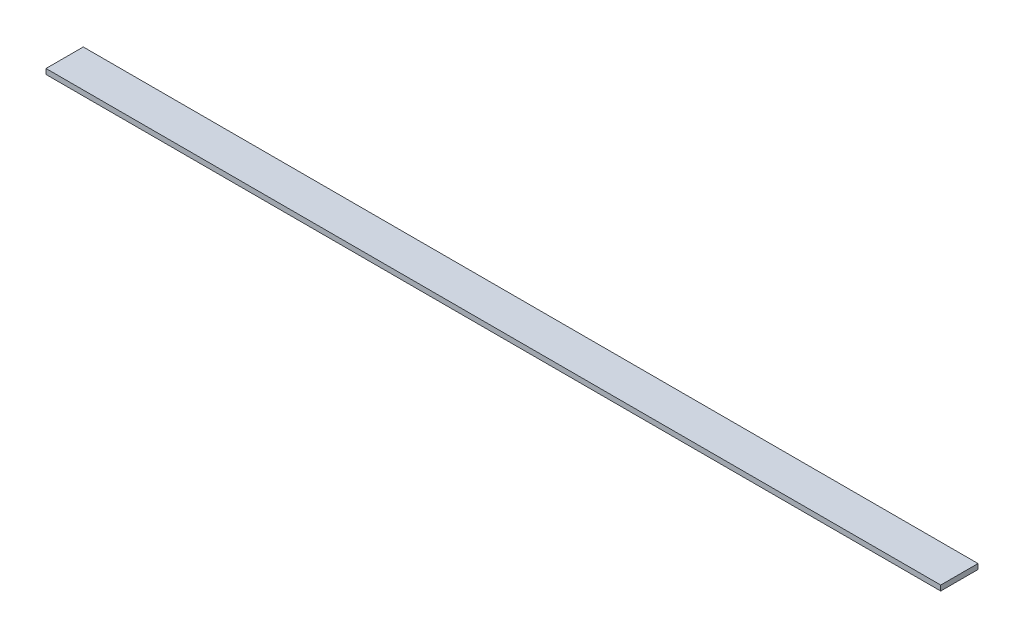
ISO-10303-21;
HEADER;
FILE_DESCRIPTION(('STEP AP214'),'2;1');
FILE_NAME('part.step','',(''),(''),'','','');
FILE_SCHEMA(('AUTOMOTIVE_DESIGN { 1 0 10303 214 1 1 1 1 }'));
ENDSEC;
DATA;
#1=APPLICATION_CONTEXT('core data for automotive mechanical design processes');
#2=APPLICATION_PROTOCOL_DEFINITION('international standard','automotive_design',2000,#1);
#3=PRODUCT_CONTEXT('',#1,'mechanical');
#4=PRODUCT('Part','Part','',(#3));
#5=PRODUCT_RELATED_PRODUCT_CATEGORY('part','',(#4));
#6=PRODUCT_DEFINITION_FORMATION('','',#4);
#7=PRODUCT_DEFINITION_CONTEXT('part definition',#1,'design');
#8=PRODUCT_DEFINITION('design','',#6,#7);
#9=PRODUCT_DEFINITION_SHAPE('','',#8);
#10=(LENGTH_UNIT() NAMED_UNIT(*) SI_UNIT(.MILLI.,.METRE.));
#11=(NAMED_UNIT(*) PLANE_ANGLE_UNIT() SI_UNIT($,.RADIAN.));
#12=(NAMED_UNIT(*) SI_UNIT($,.STERADIAN.) SOLID_ANGLE_UNIT());
#13=UNCERTAINTY_MEASURE_WITH_UNIT(LENGTH_MEASURE(1.E-05),#10,'distance_accuracy_value','');
#14=(GEOMETRIC_REPRESENTATION_CONTEXT(3) GLOBAL_UNCERTAINTY_ASSIGNED_CONTEXT((#13)) GLOBAL_UNIT_ASSIGNED_CONTEXT((#10,
#11,#12)) REPRESENTATION_CONTEXT('',''));
#15=CARTESIAN_POINT('',(0.,0.,0.));
#16=DIRECTION('',(0.,0.,1.));
#17=DIRECTION('',(1.,0.,0.));
#18=AXIS2_PLACEMENT_3D('',#15,#16,#17);
#19=CARTESIAN_POINT('',(60.,0.7,2.5));
#20=DIRECTION('',(-1.,0.,0.));
#21=DIRECTION('',(0.,0.,1.));
#22=AXIS2_PLACEMENT_3D('',#19,#20,#21);
#23=PLANE('',#22);
#24=DIRECTION('',(0.,0.,-1.));
#25=VECTOR('',#24,1.);
#26=CARTESIAN_POINT('',(60.,0.,2.5));
#27=LINE('',#26,#25);
#28=CARTESIAN_POINT('',(60.,0.,2.5));
#29=VERTEX_POINT('',#28);
#30=CARTESIAN_POINT('',(60.,0.,-2.5));
#31=VERTEX_POINT('',#30);
#32=EDGE_CURVE('E96',#29,#31,#27,.T.);
#33=ORIENTED_EDGE('',*,*,#32,.T.);
#34=DIRECTION('',(0.,-1.,0.));
#35=VECTOR('',#34,1.);
#36=CARTESIAN_POINT('',(60.,0.7,-2.5));
#37=LINE('',#36,#35);
#38=CARTESIAN_POINT('',(60.,0.7,-2.5));
#39=VERTEX_POINT('',#38);
#40=EDGE_CURVE('E11',#39,#31,#37,.T.);
#41=ORIENTED_EDGE('',*,*,#40,.F.);
#42=DIRECTION('',(0.,0.,-1.));
#43=VECTOR('',#42,1.);
#44=CARTESIAN_POINT('',(60.,0.7,2.5));
#45=LINE('',#44,#43);
#46=CARTESIAN_POINT('',(60.,0.7,2.5));
#47=VERTEX_POINT('',#46);
#48=EDGE_CURVE('E84',#47,#39,#45,.T.);
#49=ORIENTED_EDGE('',*,*,#48,.F.);
#50=DIRECTION('',(0.,-1.,0.));
#51=VECTOR('',#50,1.);
#52=CARTESIAN_POINT('',(60.,0.7,2.5));
#53=LINE('',#52,#51);
#54=EDGE_CURVE('E92',#47,#29,#53,.T.);
#55=ORIENTED_EDGE('',*,*,#54,.T.);
#56=EDGE_LOOP('',(#33,#41,#49,#55));
#57=FACE_BOUND('',#56,.T.);
#58=ADVANCED_FACE('F33',(#57),#23,.F.);
#59=CARTESIAN_POINT('',(-60.,0.7,-2.5));
#60=DIRECTION('',(0.,0.,1.));
#61=DIRECTION('',(1.,0.,0.));
#62=AXIS2_PLACEMENT_3D('',#59,#60,#61);
#63=PLANE('',#62);
#64=DIRECTION('',(-1.,0.,0.));
#65=VECTOR('',#64,1.);
#66=CARTESIAN_POINT('',(-60.,0.,-2.5));
#67=LINE('',#66,#65);
#68=CARTESIAN_POINT('',(-60.,0.,-2.5));
#69=VERTEX_POINT('',#68);
#70=EDGE_CURVE('E88',#31,#69,#67,.T.);
#71=ORIENTED_EDGE('',*,*,#70,.T.);
#72=DIRECTION('',(0.,-1.,0.));
#73=VECTOR('',#72,1.);
#74=CARTESIAN_POINT('',(-60.,0.7,-2.5));
#75=LINE('',#74,#73);
#76=CARTESIAN_POINT('',(-60.,0.7,-2.5));
#77=VERTEX_POINT('',#76);
#78=EDGE_CURVE('E41',#77,#69,#75,.T.);
#79=ORIENTED_EDGE('',*,*,#78,.F.);
#80=DIRECTION('',(-1.,0.,0.));
#81=VECTOR('',#80,1.);
#82=CARTESIAN_POINT('',(-60.,0.7,-2.5));
#83=LINE('',#82,#81);
#84=EDGE_CURVE('E79',#39,#77,#83,.T.);
#85=ORIENTED_EDGE('',*,*,#84,.F.);
#86=ORIENTED_EDGE('',*,*,#40,.T.);
#87=EDGE_LOOP('',(#71,#79,#85,#86));
#88=FACE_BOUND('',#87,.T.);
#89=ADVANCED_FACE('F87',(#88),#63,.F.);
#90=CARTESIAN_POINT('',(-60.,0.7,2.5));
#91=DIRECTION('',(1.,0.,0.));
#92=DIRECTION('',(0.,0.,-1.));
#93=AXIS2_PLACEMENT_3D('',#90,#91,#92);
#94=PLANE('',#93);
#95=DIRECTION('',(0.,0.,1.));
#96=VECTOR('',#95,1.);
#97=CARTESIAN_POINT('',(-60.,0.,2.5));
#98=LINE('',#97,#96);
#99=CARTESIAN_POINT('',(-60.,0.,2.5));
#100=VERTEX_POINT('',#99);
#101=EDGE_CURVE('E66',#69,#100,#98,.T.);
#102=ORIENTED_EDGE('',*,*,#101,.T.);
#103=DIRECTION('',(0.,-1.,0.));
#104=VECTOR('',#103,1.);
#105=CARTESIAN_POINT('',(-60.,0.7,2.5));
#106=LINE('',#105,#104);
#107=CARTESIAN_POINT('',(-60.,0.7,2.5));
#108=VERTEX_POINT('',#107);
#109=EDGE_CURVE('E89',#108,#100,#106,.T.);
#110=ORIENTED_EDGE('',*,*,#109,.F.);
#111=DIRECTION('',(0.,0.,1.));
#112=VECTOR('',#111,1.);
#113=CARTESIAN_POINT('',(-60.,0.7,2.5));
#114=LINE('',#113,#112);
#115=EDGE_CURVE('E82',#77,#108,#114,.T.);
#116=ORIENTED_EDGE('',*,*,#115,.F.);
#117=ORIENTED_EDGE('',*,*,#78,.T.);
#118=EDGE_LOOP('',(#102,#110,#116,#117));
#119=FACE_BOUND('',#118,.T.);
#120=ADVANCED_FACE('F90',(#119),#94,.F.);
#121=CARTESIAN_POINT('',(-60.,0.7,2.5));
#122=DIRECTION('',(0.,0.,-1.));
#123=DIRECTION('',(-1.,0.,0.));
#124=AXIS2_PLACEMENT_3D('',#121,#122,#123);
#125=PLANE('',#124);
#126=DIRECTION('',(1.,0.,0.));
#127=VECTOR('',#126,1.);
#128=CARTESIAN_POINT('',(-60.,0.,2.5));
#129=LINE('',#128,#127);
#130=EDGE_CURVE('E72',#100,#29,#129,.T.);
#131=ORIENTED_EDGE('',*,*,#130,.T.);
#132=ORIENTED_EDGE('',*,*,#54,.F.);
#133=DIRECTION('',(1.,0.,0.));
#134=VECTOR('',#133,1.);
#135=CARTESIAN_POINT('',(-60.,0.7,2.5));
#136=LINE('',#135,#134);
#137=EDGE_CURVE('E49',#108,#47,#136,.T.);
#138=ORIENTED_EDGE('',*,*,#137,.F.);
#139=ORIENTED_EDGE('',*,*,#109,.T.);
#140=EDGE_LOOP('',(#131,#132,#138,#139));
#141=FACE_BOUND('',#140,.T.);
#142=ADVANCED_FACE('F103',(#141),#125,.F.);
#143=CARTESIAN_POINT('',(0.,0.7,0.));
#144=DIRECTION('',(0.,-1.,0.));
#145=DIRECTION('',(0.,0.,-1.));
#146=AXIS2_PLACEMENT_3D('',#143,#144,#145);
#147=PLANE('',#146);
#148=ORIENTED_EDGE('',*,*,#48,.T.);
#149=ORIENTED_EDGE('',*,*,#84,.T.);
#150=ORIENTED_EDGE('',*,*,#115,.T.);
#151=ORIENTED_EDGE('',*,*,#137,.T.);
#152=EDGE_LOOP('',(#148,#149,#150,#151));
#153=FACE_BOUND('',#152,.T.);
#154=ADVANCED_FACE('F80',(#153),#147,.F.);
#155=CARTESIAN_POINT('',(0.,0.,0.));
#156=DIRECTION('',(0.,-1.,0.));
#157=DIRECTION('',(0.,0.,-1.));
#158=AXIS2_PLACEMENT_3D('',#155,#156,#157);
#159=PLANE('',#158);
#160=ORIENTED_EDGE('',*,*,#32,.F.);
#161=ORIENTED_EDGE('',*,*,#130,.F.);
#162=ORIENTED_EDGE('',*,*,#101,.F.);
#163=ORIENTED_EDGE('',*,*,#70,.F.);
#164=EDGE_LOOP('',(#160,#161,#162,#163));
#165=FACE_BOUND('',#164,.T.);
#166=ADVANCED_FACE('F106',(#165),#159,.T.);
#167=CLOSED_SHELL('',(#58,#89,#120,#142,#154,#166));
#168=MANIFOLD_SOLID_BREP('B2',#167);
#169=ADVANCED_BREP_SHAPE_REPRESENTATION('',(#18,#168),#14);
#170=SHAPE_DEFINITION_REPRESENTATION(#9,#169);
ENDSEC;
END-ISO-10303-21;
